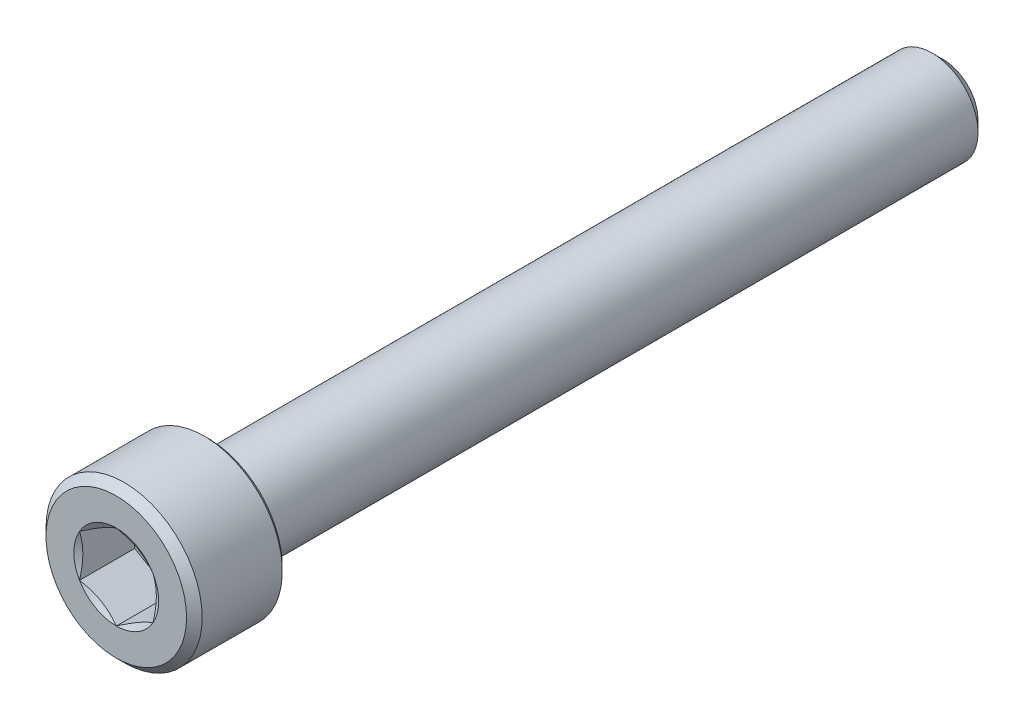
ISO-10303-21;
HEADER;
FILE_DESCRIPTION(('STEP AP214'),'2;1');
FILE_NAME('part.step','',(''),(''),'','','');
FILE_SCHEMA(('AUTOMOTIVE_DESIGN { 1 0 10303 214 1 1 1 1 }'));
ENDSEC;
DATA;
#1=APPLICATION_CONTEXT('core data for automotive mechanical design processes');
#2=APPLICATION_PROTOCOL_DEFINITION('international standard','automotive_design',2000,#1);
#3=PRODUCT_CONTEXT('',#1,'mechanical');
#4=PRODUCT('Part','Part','',(#3));
#5=PRODUCT_RELATED_PRODUCT_CATEGORY('part','',(#4));
#6=PRODUCT_DEFINITION_FORMATION('','',#4);
#7=PRODUCT_DEFINITION_CONTEXT('part definition',#1,'design');
#8=PRODUCT_DEFINITION('design','',#6,#7);
#9=PRODUCT_DEFINITION_SHAPE('','',#8);
#10=(LENGTH_UNIT() NAMED_UNIT(*) SI_UNIT(.MILLI.,.METRE.));
#11=(NAMED_UNIT(*) PLANE_ANGLE_UNIT() SI_UNIT($,.RADIAN.));
#12=(NAMED_UNIT(*) SI_UNIT($,.STERADIAN.) SOLID_ANGLE_UNIT());
#13=UNCERTAINTY_MEASURE_WITH_UNIT(LENGTH_MEASURE(1.E-05),#10,'distance_accuracy_value','');
#14=(GEOMETRIC_REPRESENTATION_CONTEXT(3) GLOBAL_UNCERTAINTY_ASSIGNED_CONTEXT((#13)) GLOBAL_UNIT_ASSIGNED_CONTEXT((#10,
#11,#12)) REPRESENTATION_CONTEXT('',''));
#15=CARTESIAN_POINT('',(0.,0.,0.));
#16=DIRECTION('',(0.,0.,1.));
#17=DIRECTION('',(1.,0.,0.));
#18=AXIS2_PLACEMENT_3D('',#15,#16,#17);
#19=CARTESIAN_POINT('',(-4.03749999999997,0.,17.5));
#20=DIRECTION('',(0.,0.,-1.));
#21=DIRECTION('',(-1.,0.,0.));
#22=AXIS2_PLACEMENT_3D('',#19,#20,#21);
#23=PLANE('',#22);
#24=CARTESIAN_POINT('',(0.,0.,17.5));
#25=DIRECTION('',(0.,0.,-1.));
#26=DIRECTION('',(-1.,0.,0.));
#27=AXIS2_PLACEMENT_3D('',#24,#25,#26);
#28=CIRCLE('',#27,2.5);
#29=CARTESIAN_POINT('',(-2.5,0.,17.5));
#30=VERTEX_POINT('',#29);
#31=EDGE_CURVE('E12',#30,#30,#28,.T.);
#32=ORIENTED_EDGE('',*,*,#31,.F.);
#33=EDGE_LOOP('',(#32));
#34=FACE_BOUND('',#33,.T.);
#35=CARTESIAN_POINT('',(0.,0.,17.5));
#36=DIRECTION('',(0.,0.,-1.));
#37=DIRECTION('',(-1.,0.,0.));
#38=AXIS2_PLACEMENT_3D('',#35,#36,#37);
#39=CIRCLE('',#38,4.03749999999997);
#40=CARTESIAN_POINT('',(-4.03749999999997,0.,17.5));
#41=VERTEX_POINT('',#40);
#42=EDGE_CURVE('E260',#41,#41,#39,.T.);
#43=ORIENTED_EDGE('',*,*,#42,.T.);
#44=EDGE_LOOP('',(#43));
#45=FACE_BOUND('',#44,.T.);
#46=ADVANCED_FACE('F42',(#34,#45),#23,.T.);
#47=CARTESIAN_POINT('',(0.,0.,19.5));
#48=DIRECTION('',(0.,0.,1.));
#49=DIRECTION('',(1.,0.,0.));
#50=AXIS2_PLACEMENT_3D('',#47,#48,#49);
#51=PLANE('',#50);
#52=DIRECTION('',(-0.866025403784439,0.5,0.));
#53=VECTOR('',#52,1.);
#54=CARTESIAN_POINT('',(2.,1.15470053837925,19.5));
#55=LINE('',#54,#53);
#56=CARTESIAN_POINT('',(2.,1.15470053837925,19.5));
#57=VERTEX_POINT('',#56);
#58=CARTESIAN_POINT('',(0.,2.3094010767585,19.5));
#59=VERTEX_POINT('',#58);
#60=EDGE_CURVE('E108',#57,#59,#55,.T.);
#61=ORIENTED_EDGE('',*,*,#60,.T.);
#62=DIRECTION('',(-0.866025403784438,-0.5,0.));
#63=VECTOR('',#62,1.);
#64=CARTESIAN_POINT('',(0.,2.3094010767585,19.5));
#65=LINE('',#64,#63);
#66=CARTESIAN_POINT('',(-2.,1.15470053837925,19.5));
#67=VERTEX_POINT('',#66);
#68=EDGE_CURVE('E227',#59,#67,#65,.T.);
#69=ORIENTED_EDGE('',*,*,#68,.T.);
#70=DIRECTION('',(0.,-1.,0.));
#71=VECTOR('',#70,1.);
#72=CARTESIAN_POINT('',(-2.,1.15470053837925,19.5));
#73=LINE('',#72,#71);
#74=CARTESIAN_POINT('',(-2.,-1.15470053837925,19.5));
#75=VERTEX_POINT('',#74);
#76=EDGE_CURVE('E230',#67,#75,#73,.T.);
#77=ORIENTED_EDGE('',*,*,#76,.T.);
#78=DIRECTION('',(0.866025403784439,-0.5,0.));
#79=VECTOR('',#78,1.);
#80=CARTESIAN_POINT('',(-2.,-1.15470053837925,19.5));
#81=LINE('',#80,#79);
#82=CARTESIAN_POINT('',(0.,-2.3094010767585,19.5));
#83=VERTEX_POINT('',#82);
#84=EDGE_CURVE('E231',#75,#83,#81,.T.);
#85=ORIENTED_EDGE('',*,*,#84,.T.);
#86=DIRECTION('',(0.866025403784439,0.5,0.));
#87=VECTOR('',#86,1.);
#88=CARTESIAN_POINT('',(0.,-2.3094010767585,19.5));
#89=LINE('',#88,#87);
#90=CARTESIAN_POINT('',(2.,-1.15470053837925,19.5));
#91=VERTEX_POINT('',#90);
#92=EDGE_CURVE('E236',#83,#91,#89,.T.);
#93=ORIENTED_EDGE('',*,*,#92,.T.);
#94=DIRECTION('',(0.,1.,0.));
#95=VECTOR('',#94,1.);
#96=CARTESIAN_POINT('',(2.,-1.15470053837925,19.5));
#97=LINE('',#96,#95);
#98=EDGE_CURVE('E229',#91,#57,#97,.T.);
#99=ORIENTED_EDGE('',*,*,#98,.T.);
#100=EDGE_LOOP('',(#61,#69,#77,#85,#93,#99));
#101=FACE_BOUND('',#100,.T.);
#102=ADVANCED_FACE('F216',(#101),#51,.T.);
#103=CARTESIAN_POINT('',(0.,2.3094010767585,19.5));
#104=DIRECTION('',(-0.5,0.866025403784439,0.));
#105=DIRECTION('',(-0.866025403784439,-0.5,0.));
#106=AXIS2_PLACEMENT_3D('',#103,#104,#105);
#107=PLANE('',#106);
#108=DIRECTION('',(0.,0.,1.));
#109=VECTOR('',#108,1.);
#110=CARTESIAN_POINT('',(0.,2.3094010767585,19.5));
#111=LINE('',#110,#109);
#112=CARTESIAN_POINT('',(0.,2.3094010767585,22.5));
#113=VERTEX_POINT('',#112);
#114=EDGE_CURVE('E64',#59,#113,#111,.T.);
#115=ORIENTED_EDGE('',*,*,#114,.T.);
#116=CARTESIAN_POINT('',(0.000199999999999582,2.30951654681234,22.5000666716664));
#117=CARTESIAN_POINT('',(-0.0876912629000605,2.25877250251757,22.4707567411466));
#118=CARTESIAN_POINT('',(-0.176341194473592,2.20759044065995,22.4441000570264));
#119=CARTESIAN_POINT('',(-0.355176246997803,2.10433997494456,22.3975696960667));
#120=CARTESIAN_POINT('',(-0.445364546505037,2.0522697359463,22.3777124814287));
#121=CARTESIAN_POINT('',(-0.624623385763307,1.94877459684592,22.3468006690692));
#122=CARTESIAN_POINT('',(-0.713666338226305,1.89736562427197,22.3355403566445));
#123=CARTESIAN_POINT('',(-0.892171397785044,1.79430568008402,22.3220958676406));
#124=CARTESIAN_POINT('',(-0.981632855703959,1.74265508327244,22.3199005599994));
#125=CARTESIAN_POINT('',(-1.1488083535488,1.64613626458981,22.3244581943766));
#126=CARTESIAN_POINT('',(-1.22654737026578,1.60125362236172,22.3300920797329));
#127=CARTESIAN_POINT('',(-1.38151891453613,1.51178075956051,22.3479511003068));
#128=CARTESIAN_POINT('',(-1.4587509057412,1.46719084864821,22.3601823410694));
#129=CARTESIAN_POINT('',(-1.6140421864822,1.37753338590959,22.3907606419135));
#130=CARTESIAN_POINT('',(-1.69208181310738,1.33247718647009,22.4092373721116));
#131=CARTESIAN_POINT('',(-1.84699686569213,1.24303693915875,22.4511727232588));
#132=CARTESIAN_POINT('',(-1.92387427762312,1.1986517446858,22.4746214855382));
#133=CARTESIAN_POINT('',(-2.0002,1.15458506832541,22.5000666716664));
#134=B_SPLINE_CURVE_WITH_KNOTS('',3,(#116,#117,#118,#119,#120,#121,#122,#123,#124,#125,#126,
#127,#128,#129,#130,#131,#132,#133),.UNSPECIFIED.,.F.,.F.,(4,2,2,2,2,2,2,2,4),(0.,
0.317031824695609,0.634825876346563,0.944753967652636,1.25430138000371,1.52387047293094,
1.79368946861028,2.06949491027634,2.34475850821472),.UNSPECIFIED.);
#135=CARTESIAN_POINT('',(-2.,1.15470053837925,22.5));
#136=VERTEX_POINT('',#135);
#137=EDGE_CURVE('E121',#113,#136,#134,.T.);
#138=ORIENTED_EDGE('',*,*,#137,.T.);
#139=DIRECTION('',(0.,0.,1.));
#140=VECTOR('',#139,1.);
#141=CARTESIAN_POINT('',(-2.,1.15470053837925,19.5));
#142=LINE('',#141,#140);
#143=EDGE_CURVE('E245',#67,#136,#142,.T.);
#144=ORIENTED_EDGE('',*,*,#143,.F.);
#145=ORIENTED_EDGE('',*,*,#68,.F.);
#146=EDGE_LOOP('',(#115,#138,#144,#145));
#147=FACE_BOUND('',#146,.T.);
#148=ADVANCED_FACE('F155',(#147),#107,.F.);
#149=CARTESIAN_POINT('',(-2.,1.15470053837925,19.5));
#150=DIRECTION('',(-1.,0.,0.));
#151=DIRECTION('',(0.,-1.,0.));
#152=AXIS2_PLACEMENT_3D('',#149,#150,#151);
#153=PLANE('',#152);
#154=ORIENTED_EDGE('',*,*,#143,.T.);
#155=CARTESIAN_POINT('',(-2.,-2.99029024286746,23.2436705774789));
#156=CARTESIAN_POINT('',(-2.,-2.9039233549122,23.2022350128154));
#157=CARTESIAN_POINT('',(-2.,-2.81734606544375,23.1612298310159));
#158=CARTESIAN_POINT('',(-2.,-2.64365854493735,23.0803243821909));
#159=CARTESIAN_POINT('',(-2.,-2.55654822138744,23.0404243140125));
#160=CARTESIAN_POINT('',(-2.,-2.38118302896117,22.9617503389695));
#161=CARTESIAN_POINT('',(-2.,-2.29292442261223,22.9229847316336));
#162=CARTESIAN_POINT('',(-2.,-2.11566660170982,22.8471918635543));
#163=CARTESIAN_POINT('',(-2.,-2.02666742594867,22.8101645124244));
#164=CARTESIAN_POINT('',(-2.,-1.84544249851511,22.7373681681925));
#165=CARTESIAN_POINT('',(-2.,-1.75319322532995,22.701657387434));
#166=CARTESIAN_POINT('',(-2.,-1.56757885700113,22.6332048464352));
#167=CARTESIAN_POINT('',(-2.,-1.4742136338563,22.6004634305571));
#168=CARTESIAN_POINT('',(-2.,-1.28643446361951,22.5388859327172));
#169=CARTESIAN_POINT('',(-2.,-1.19202351048257,22.5100408191443));
#170=CARTESIAN_POINT('',(-2.,-1.00184859453872,22.4572423245238));
#171=CARTESIAN_POINT('',(-2.,-0.906084974095544,22.4332877285792));
#172=CARTESIAN_POINT('',(-2.,-0.713403981060254,22.3915474538638));
#173=CARTESIAN_POINT('',(-2.,-0.616489407871837,22.3737491049484));
#174=CARTESIAN_POINT('',(-2.,-0.421576659767191,22.3454859555612));
#175=CARTESIAN_POINT('',(-2.,-0.323578558532563,22.3350206595082));
#176=CARTESIAN_POINT('',(-2.,-0.128212412243735,22.3223976828881));
#177=CARTESIAN_POINT('',(-2.,-0.0308508865278537,22.3201419664817));
#178=CARTESIAN_POINT('',(-2.,0.163710907351544,22.3238660001585));
#179=CARTESIAN_POINT('',(-2.,0.26091116515686,22.3298462601828));
#180=CARTESIAN_POINT('',(-2.,0.500738496706,22.3542367986828));
#181=CARTESIAN_POINT('',(-2.,0.642900874941927,22.3772179857328));
#182=CARTESIAN_POINT('',(-2.,0.924461055762405,22.4364797724985));
#183=CARTESIAN_POINT('',(-2.,1.06385531203148,22.4727764011974));
#184=CARTESIAN_POINT('',(-2.,1.27233476439731,22.5347799260889));
#185=CARTESIAN_POINT('',(-2.,1.34249760828297,22.5569967132613));
#186=CARTESIAN_POINT('',(-2.,1.48209294499886,22.6034854664852));
#187=CARTESIAN_POINT('',(-2.,1.5515258636265,22.6277561499463));
#188=CARTESIAN_POINT('',(-2.,1.68975413890005,22.6780002153862));
#189=CARTESIAN_POINT('',(-2.,1.75854960883308,22.7039732879257));
#190=CARTESIAN_POINT('',(-2.,1.89559846372949,22.7573411907401));
#191=CARTESIAN_POINT('',(-2.,1.96385175484502,22.7847362612267));
#192=CARTESIAN_POINT('',(-2.,2.1380709928287,22.8564181386155));
#193=CARTESIAN_POINT('',(-2.,2.24368858156614,22.901550707622));
#194=CARTESIAN_POINT('',(-2.,2.45396999511266,22.9939914959886));
#195=CARTESIAN_POINT('',(-2.,2.55863374776564,23.0412998783351));
#196=CARTESIAN_POINT('',(-2.,2.87151206778261,23.1857217451608));
#197=CARTESIAN_POINT('',(-2.,3.0785787487255,23.2853171433883));
#198=CARTESIAN_POINT('',(-2.,3.49094307145926,23.4886849551519));
#199=CARTESIAN_POINT('',(-2.,3.69623822556834,23.5924623531372));
#200=CARTESIAN_POINT('',(-2.,4.10542196763743,23.8026856010433));
#201=CARTESIAN_POINT('',(-2.,4.30931073022524,23.9091311117793));
#202=CARTESIAN_POINT('',(-2.,4.69691639401988,24.113726514207));
#203=CARTESIAN_POINT('',(-2.,4.88072085209384,24.2117111050986));
#204=CARTESIAN_POINT('',(-2.,5.2477385233816,24.4087967213488));
#205=CARTESIAN_POINT('',(-2.,5.43095171439014,24.5078977880236));
#206=CARTESIAN_POINT('',(-2.,5.79645714315414,24.7066832443465));
#207=CARTESIAN_POINT('',(-2.,5.97875053807595,24.8063655091631));
#208=CARTESIAN_POINT('',(-2.,6.34296877430456,25.0063788260171));
#209=CARTESIAN_POINT('',(-2.,6.52489363439936,25.1067098438291));
#210=CARTESIAN_POINT('',(-2.,6.70668608827319,25.2072787608358));
#211=B_SPLINE_CURVE_WITH_KNOTS('',3,(#155,#156,#157,#158,#159,#160,#161,#162,#163,#164,#165,
#166,#167,#168,#169,#170,#171,#172,#173,#174,#175,#176,#177,#178,#179,#180,#181,#182,#183,#184,
#185,#186,#187,#188,#189,#190,#191,#192,#193,#194,#195,#196,#197,#198,#199,#200,#201,#202,#203,
#204,#205,#206,#207,#208,#209,#210),.UNSPECIFIED.,.F.,.F.,(4,2,2,2,2,2,2,2,2,2,2,2,2,2,2,2,2,2,
2,2,2,2,2,2,2,2,2,4),(0.,0.287380681388115,0.574812740623684,0.863988372930492,1.15314895189072,
1.4498698259759,1.74662506739396,2.04268017375204,2.33866164470185,2.63403028141922,
2.92937895465126,3.22118888927989,3.51301689251078,3.94415417741651,4.37581217290736,
4.59657665342085,4.81720427698904,5.03779190819845,5.25841692430919,5.60295100374334,
5.94751093378603,6.63674459882491,7.32682556520813,8.01681924533215,8.6416872890753,
9.26657853306545,9.88988035134099,10.5131495508289),.UNSPECIFIED.);
#212=CARTESIAN_POINT('',(-2.,-1.15470053837926,22.5));
#213=VERTEX_POINT('',#212);
#214=EDGE_CURVE('E128',#136,#213,#211,.F.);
#215=ORIENTED_EDGE('',*,*,#214,.T.);
#216=DIRECTION('',(0.,0.,1.));
#217=VECTOR('',#216,1.);
#218=CARTESIAN_POINT('',(-2.,-1.15470053837925,19.5));
#219=LINE('',#218,#217);
#220=EDGE_CURVE('E243',#75,#213,#219,.T.);
#221=ORIENTED_EDGE('',*,*,#220,.F.);
#222=ORIENTED_EDGE('',*,*,#76,.F.);
#223=EDGE_LOOP('',(#154,#215,#221,#222));
#224=FACE_BOUND('',#223,.T.);
#225=ADVANCED_FACE('F150',(#224),#153,.F.);
#226=CARTESIAN_POINT('',(-2.,-1.15470053837925,19.5));
#227=DIRECTION('',(-0.5,-0.866025403784439,0.));
#228=DIRECTION('',(0.866025403784439,-0.5,0.));
#229=AXIS2_PLACEMENT_3D('',#226,#227,#228);
#230=PLANE('',#229);
#231=ORIENTED_EDGE('',*,*,#220,.T.);
#232=CARTESIAN_POINT('',(-2.0002,-1.15458506832541,22.5000666716664));
#233=CARTESIAN_POINT('',(-1.91230873709994,-1.20532911262018,22.4707567411466));
#234=CARTESIAN_POINT('',(-1.82365880552641,-1.2565111744778,22.4441000570264));
#235=CARTESIAN_POINT('',(-1.6448237530022,-1.35976164019319,22.3975696960666));
#236=CARTESIAN_POINT('',(-1.55463545349496,-1.41183187919145,22.3777124814287));
#237=CARTESIAN_POINT('',(-1.37537661423669,-1.51532701829183,22.3468006690692));
#238=CARTESIAN_POINT('',(-1.2863336617737,-1.56673599086578,22.3355403566445));
#239=CARTESIAN_POINT('',(-1.10782860221496,-1.66979593505373,22.3220958676406));
#240=CARTESIAN_POINT('',(-1.01836714429604,-1.72144653186531,22.3199005599994));
#241=CARTESIAN_POINT('',(-0.851191646451201,-1.81796535054794,22.3244581943766));
#242=CARTESIAN_POINT('',(-0.773452629734216,-1.86284799277603,22.3300920797329));
#243=CARTESIAN_POINT('',(-0.618481085463866,-1.95232085557725,22.3479511003068));
#244=CARTESIAN_POINT('',(-0.541249094258801,-1.99691076648954,22.3601823410694));
#245=CARTESIAN_POINT('',(-0.385957813517799,-2.08656822922816,22.3907606419135));
#246=CARTESIAN_POINT('',(-0.30791818689262,-2.13162442866767,22.4092373721116));
#247=CARTESIAN_POINT('',(-0.153003134307865,-2.221064675979,22.4511727232588));
#248=CARTESIAN_POINT('',(-0.07612572237688,-2.26544987045196,22.4746214855382));
#249=CARTESIAN_POINT('',(0.000200000000000351,-2.30951654681234,22.5000666716664));
#250=B_SPLINE_CURVE_WITH_KNOTS('',3,(#232,#233,#234,#235,#236,#237,#238,#239,#240,#241,#242,
#243,#244,#245,#246,#247,#248,#249),.UNSPECIFIED.,.F.,.F.,(4,2,2,2,2,2,2,2,4),(0.,
0.31703182469561,0.634825876346564,0.944753967652636,1.25430138000371,1.52387047293094,
1.79368946861028,2.06949491027634,2.34475850821472),.UNSPECIFIED.);
#251=CARTESIAN_POINT('',(0.,-2.30940107675851,22.5));
#252=VERTEX_POINT('',#251);
#253=EDGE_CURVE('E131',#213,#252,#250,.T.);
#254=ORIENTED_EDGE('',*,*,#253,.T.);
#255=DIRECTION('',(0.,0.,1.));
#256=VECTOR('',#255,1.);
#257=CARTESIAN_POINT('',(0.,-2.3094010767585,19.5));
#258=LINE('',#257,#256);
#259=EDGE_CURVE('E240',#83,#252,#258,.T.);
#260=ORIENTED_EDGE('',*,*,#259,.F.);
#261=ORIENTED_EDGE('',*,*,#84,.F.);
#262=EDGE_LOOP('',(#231,#254,#260,#261));
#263=FACE_BOUND('',#262,.T.);
#264=ADVANCED_FACE('F154',(#263),#230,.F.);
#265=CARTESIAN_POINT('',(0.,-2.3094010767585,19.5));
#266=DIRECTION('',(0.5,-0.866025403784438,0.));
#267=DIRECTION('',(0.866025403784439,0.5,0.));
#268=AXIS2_PLACEMENT_3D('',#265,#266,#267);
#269=PLANE('',#268);
#270=ORIENTED_EDGE('',*,*,#259,.T.);
#271=CARTESIAN_POINT('',(-0.000199999999999377,-2.30951654681234,22.5000666716664));
#272=CARTESIAN_POINT('',(0.0876912629000602,-2.25877250251758,22.4707567411466));
#273=CARTESIAN_POINT('',(0.176341194473591,-2.20759044065996,22.4441000570264));
#274=CARTESIAN_POINT('',(0.355176246997802,-2.10433997494456,22.3975696960666));
#275=CARTESIAN_POINT('',(0.445364546505036,-2.05226973594631,22.3777124814287));
#276=CARTESIAN_POINT('',(0.624623385763306,-1.94877459684592,22.3468006690692));
#277=CARTESIAN_POINT('',(0.713666338226304,-1.89736562427197,22.3355403566445));
#278=CARTESIAN_POINT('',(0.892171397785043,-1.79430568008402,22.3220958676406));
#279=CARTESIAN_POINT('',(0.981632855703958,-1.74265508327244,22.3199005599994));
#280=CARTESIAN_POINT('',(1.1488083535488,-1.64613626458981,22.3244581943766));
#281=CARTESIAN_POINT('',(1.22654737026578,-1.60125362236173,22.3300920797329));
#282=CARTESIAN_POINT('',(1.38151891453613,-1.51178075956051,22.3479511003068));
#283=CARTESIAN_POINT('',(1.4587509057412,-1.46719084864821,22.3601823410694));
#284=CARTESIAN_POINT('',(1.6140421864822,-1.37753338590959,22.3907606419135));
#285=CARTESIAN_POINT('',(1.69208181310738,-1.33247718647009,22.4092373721116));
#286=CARTESIAN_POINT('',(1.84699686569214,-1.24303693915875,22.4511727232588));
#287=CARTESIAN_POINT('',(1.92387427762312,-1.1986517446858,22.4746214855382));
#288=CARTESIAN_POINT('',(2.0002,-1.15458506832541,22.5000666716664));
#289=B_SPLINE_CURVE_WITH_KNOTS('',3,(#271,#272,#273,#274,#275,#276,#277,#278,#279,#280,#281,
#282,#283,#284,#285,#286,#287,#288),.UNSPECIFIED.,.F.,.F.,(4,2,2,2,2,2,2,2,4),(0.,
0.317031824695609,0.634825876346563,0.944753967652635,1.25430138000371,1.52387047293094,
1.79368946861028,2.06949491027634,2.34475850821472),.UNSPECIFIED.);
#290=CARTESIAN_POINT('',(2.,-1.15470053837925,22.5));
#291=VERTEX_POINT('',#290);
#292=EDGE_CURVE('E116',#252,#291,#289,.T.);
#293=ORIENTED_EDGE('',*,*,#292,.T.);
#294=DIRECTION('',(0.,0.,1.));
#295=VECTOR('',#294,1.);
#296=CARTESIAN_POINT('',(2.,-1.15470053837925,19.5));
#297=LINE('',#296,#295);
#298=EDGE_CURVE('E114',#91,#291,#297,.T.);
#299=ORIENTED_EDGE('',*,*,#298,.F.);
#300=ORIENTED_EDGE('',*,*,#92,.F.);
#301=EDGE_LOOP('',(#270,#293,#299,#300));
#302=FACE_BOUND('',#301,.T.);
#303=ADVANCED_FACE('F161',(#302),#269,.F.);
#304=CARTESIAN_POINT('',(2.,-1.15470053837925,19.5));
#305=DIRECTION('',(1.,0.,0.));
#306=DIRECTION('',(0.,0.,-1.));
#307=AXIS2_PLACEMENT_3D('',#304,#305,#306);
#308=PLANE('',#307);
#309=ORIENTED_EDGE('',*,*,#298,.T.);
#310=CARTESIAN_POINT('',(2.,-2.99029024286747,23.2436705774789));
#311=CARTESIAN_POINT('',(2.,-2.9039233549122,23.2022350128154));
#312=CARTESIAN_POINT('',(2.,-2.81734606544376,23.1612298310159));
#313=CARTESIAN_POINT('',(2.,-2.64365854493735,23.0803243821909));
#314=CARTESIAN_POINT('',(2.,-2.55654822138744,23.0404243140125));
#315=CARTESIAN_POINT('',(2.,-2.38118302896117,22.9617503389695));
#316=CARTESIAN_POINT('',(2.,-2.29292442261223,22.9229847316336));
#317=CARTESIAN_POINT('',(2.,-2.11566660170982,22.8471918635543));
#318=CARTESIAN_POINT('',(2.,-2.02666742594867,22.8101645124244));
#319=CARTESIAN_POINT('',(2.,-1.84544249851511,22.7373681681925));
#320=CARTESIAN_POINT('',(2.,-1.75319322532995,22.701657387434));
#321=CARTESIAN_POINT('',(2.,-1.56757885700113,22.6332048464352));
#322=CARTESIAN_POINT('',(2.,-1.4742136338563,22.6004634305571));
#323=CARTESIAN_POINT('',(2.,-1.28643446361951,22.5388859327172));
#324=CARTESIAN_POINT('',(2.,-1.19202351048257,22.5100408191443));
#325=CARTESIAN_POINT('',(2.,-1.00184859453872,22.4572423245238));
#326=CARTESIAN_POINT('',(2.,-0.906084974095544,22.4332877285792));
#327=CARTESIAN_POINT('',(2.,-0.713403981060254,22.3915474538638));
#328=CARTESIAN_POINT('',(2.,-0.616489407871837,22.3737491049484));
#329=CARTESIAN_POINT('',(2.,-0.421576659767191,22.3454859555612));
#330=CARTESIAN_POINT('',(2.,-0.323578558532563,22.3350206595082));
#331=CARTESIAN_POINT('',(2.,-0.128212412243735,22.3223976828881));
#332=CARTESIAN_POINT('',(2.,-0.0308508865278543,22.3201419664817));
#333=CARTESIAN_POINT('',(2.,0.163710907351543,22.3238660001585));
#334=CARTESIAN_POINT('',(2.,0.260911165156859,22.3298462601828));
#335=CARTESIAN_POINT('',(2.,0.500738496705998,22.3542367986828));
#336=CARTESIAN_POINT('',(2.,0.642900874941925,22.3772179857328));
#337=CARTESIAN_POINT('',(2.,0.924461055762403,22.4364797724985));
#338=CARTESIAN_POINT('',(2.,1.06385531203148,22.4727764011974));
#339=CARTESIAN_POINT('',(2.,1.27233476439731,22.5347799260889));
#340=CARTESIAN_POINT('',(2.,1.34249760828297,22.5569967132613));
#341=CARTESIAN_POINT('',(2.,1.48209294499886,22.6034854664852));
#342=CARTESIAN_POINT('',(2.,1.5515258636265,22.6277561499463));
#343=CARTESIAN_POINT('',(2.,1.68975413890004,22.6780002153862));
#344=CARTESIAN_POINT('',(2.,1.75854960883307,22.7039732879257));
#345=CARTESIAN_POINT('',(2.,1.89559846372949,22.7573411907401));
#346=CARTESIAN_POINT('',(2.,1.96385175484502,22.7847362612267));
#347=CARTESIAN_POINT('',(2.,2.1380709928287,22.8564181386155));
#348=CARTESIAN_POINT('',(2.,2.24368858156614,22.901550707622));
#349=CARTESIAN_POINT('',(2.,2.45396999511265,22.9939914959886));
#350=CARTESIAN_POINT('',(2.,2.55863374776564,23.0412998783351));
#351=CARTESIAN_POINT('',(2.,2.87151206778261,23.1857217451608));
#352=CARTESIAN_POINT('',(2.,3.0785787487255,23.2853171433883));
#353=CARTESIAN_POINT('',(2.,3.49094307145926,23.4886849551519));
#354=CARTESIAN_POINT('',(2.,3.69623822556834,23.5924623531372));
#355=CARTESIAN_POINT('',(2.,4.10542196763743,23.8026856010433));
#356=CARTESIAN_POINT('',(2.,4.30931073022524,23.9091311117793));
#357=CARTESIAN_POINT('',(2.,4.69691639401988,24.113726514207));
#358=CARTESIAN_POINT('',(2.,4.88072085209384,24.2117111050986));
#359=CARTESIAN_POINT('',(2.,5.2477385233816,24.4087967213488));
#360=CARTESIAN_POINT('',(2.,5.43095171439014,24.5078977880236));
#361=CARTESIAN_POINT('',(2.,5.79645714315414,24.7066832443465));
#362=CARTESIAN_POINT('',(2.,5.97875053807595,24.8063655091631));
#363=CARTESIAN_POINT('',(2.,6.34296877430456,25.0063788260171));
#364=CARTESIAN_POINT('',(2.,6.52489363439936,25.1067098438291));
#365=CARTESIAN_POINT('',(2.,6.70668608827319,25.2072787608358));
#366=B_SPLINE_CURVE_WITH_KNOTS('',3,(#310,#311,#312,#313,#314,#315,#316,#317,#318,#319,#320,
#321,#322,#323,#324,#325,#326,#327,#328,#329,#330,#331,#332,#333,#334,#335,#336,#337,#338,#339,
#340,#341,#342,#343,#344,#345,#346,#347,#348,#349,#350,#351,#352,#353,#354,#355,#356,#357,#358,
#359,#360,#361,#362,#363,#364,#365),.UNSPECIFIED.,.F.,.F.,(4,2,2,2,2,2,2,2,2,2,2,2,2,2,2,2,2,2,
2,2,2,2,2,2,2,2,2,4),(0.,0.287380681388115,0.574812740623684,0.863988372930489,1.15314895189073,
1.4498698259759,1.74662506739396,2.04268017375205,2.33866164470185,2.63403028141922,
2.92937895465126,3.22118888927989,3.51301689251078,3.94415417741651,4.37581217290736,
4.59657665342085,4.81720427698904,5.03779190819845,5.25841692430919,5.60295100374334,
5.94751093378603,6.63674459882492,7.32682556520813,8.01681924533216,8.6416872890753,
9.26657853306545,9.88988035134099,10.5131495508289),.UNSPECIFIED.);
#367=CARTESIAN_POINT('',(2.,1.15470053837925,22.5));
#368=VERTEX_POINT('',#367);
#369=EDGE_CURVE('E100',#291,#368,#366,.T.);
#370=ORIENTED_EDGE('',*,*,#369,.T.);
#371=DIRECTION('',(0.,0.,1.));
#372=VECTOR('',#371,1.);
#373=CARTESIAN_POINT('',(2.,1.15470053837925,19.5));
#374=LINE('',#373,#372);
#375=EDGE_CURVE('E113',#57,#368,#374,.T.);
#376=ORIENTED_EDGE('',*,*,#375,.F.);
#377=ORIENTED_EDGE('',*,*,#98,.F.);
#378=EDGE_LOOP('',(#309,#370,#376,#377));
#379=FACE_BOUND('',#378,.T.);
#380=ADVANCED_FACE('F111',(#379),#308,.F.);
#381=CARTESIAN_POINT('',(2.,1.15470053837925,19.5));
#382=DIRECTION('',(0.5,0.866025403784439,0.));
#383=DIRECTION('',(-0.866025403784439,0.5,0.));
#384=AXIS2_PLACEMENT_3D('',#381,#382,#383);
#385=PLANE('',#384);
#386=ORIENTED_EDGE('',*,*,#375,.T.);
#387=CARTESIAN_POINT('',(2.0002,1.15458506832541,22.5000666716664));
#388=CARTESIAN_POINT('',(1.91230873709994,1.20532911262018,22.4707567411466));
#389=CARTESIAN_POINT('',(1.82365880552641,1.2565111744778,22.4441000570264));
#390=CARTESIAN_POINT('',(1.6448237530022,1.35976164019319,22.3975696960667));
#391=CARTESIAN_POINT('',(1.55463545349496,1.41183187919145,22.3777124814287));
#392=CARTESIAN_POINT('',(1.37537661423669,1.51532701829183,22.3468006690692));
#393=CARTESIAN_POINT('',(1.2863336617737,1.56673599086578,22.3355403566445));
#394=CARTESIAN_POINT('',(1.10782860221496,1.66979593505373,22.3220958676406));
#395=CARTESIAN_POINT('',(1.01836714429604,1.72144653186531,22.3199005599994));
#396=CARTESIAN_POINT('',(0.851191646451201,1.81796535054794,22.3244581943766));
#397=CARTESIAN_POINT('',(0.773452629734216,1.86284799277603,22.3300920797329));
#398=CARTESIAN_POINT('',(0.618481085463866,1.95232085557725,22.3479511003068));
#399=CARTESIAN_POINT('',(0.541249094258801,1.99691076648954,22.3601823410694));
#400=CARTESIAN_POINT('',(0.385957813517799,2.08656822922816,22.3907606419135));
#401=CARTESIAN_POINT('',(0.30791818689262,2.13162442866767,22.4092373721116));
#402=CARTESIAN_POINT('',(0.153003134307865,2.221064675979,22.4511727232588));
#403=CARTESIAN_POINT('',(0.0761257223768795,2.26544987045196,22.4746214855382));
#404=CARTESIAN_POINT('',(-0.000200000000000295,2.30951654681234,22.5000666716664));
#405=B_SPLINE_CURVE_WITH_KNOTS('',3,(#387,#388,#389,#390,#391,#392,#393,#394,#395,#396,#397,
#398,#399,#400,#401,#402,#403,#404),.UNSPECIFIED.,.F.,.F.,(4,2,2,2,2,2,2,2,4),(0.,
0.317031824695609,0.634825876346563,0.944753967652636,1.25430138000371,1.52387047293094,
1.79368946861028,2.06949491027634,2.34475850821472),.UNSPECIFIED.);
#406=EDGE_CURVE('E105',#368,#113,#405,.T.);
#407=ORIENTED_EDGE('',*,*,#406,.T.);
#408=ORIENTED_EDGE('',*,*,#114,.F.);
#409=ORIENTED_EDGE('',*,*,#60,.F.);
#410=EDGE_LOOP('',(#386,#407,#408,#409));
#411=FACE_BOUND('',#410,.T.);
#412=ADVANCED_FACE('F118',(#411),#385,.F.);
#413=CARTESIAN_POINT('',(0.,0.,22.5));
#414=DIRECTION('',(0.,0.,1.));
#415=DIRECTION('',(1.,0.,0.));
#416=AXIS2_PLACEMENT_3D('',#413,#414,#415);
#417=CONICAL_SURFACE('',#416,2.3094010767585,1.0471975511966);
#418=CARTESIAN_POINT('',(0.,0.,22.5));
#419=DIRECTION('',(0.,0.,1.));
#420=DIRECTION('',(1.,0.,0.));
#421=AXIS2_PLACEMENT_3D('',#418,#419,#420);
#422=CIRCLE('',#421,2.3094010767585);
#423=EDGE_CURVE('E127',#113,#136,#422,.T.);
#424=ORIENTED_EDGE('',*,*,#423,.T.);
#425=ORIENTED_EDGE('',*,*,#137,.F.);
#426=EDGE_LOOP('',(#424,#425));
#427=FACE_BOUND('',#426,.T.);
#428=ADVANCED_FACE('F185',(#427),#417,.F.);
#429=EDGE_CURVE('E129',#136,#213,#422,.T.);
#430=ORIENTED_EDGE('',*,*,#429,.T.);
#431=ORIENTED_EDGE('',*,*,#214,.F.);
#432=EDGE_LOOP('',(#430,#431));
#433=FACE_BOUND('',#432,.T.);
#434=ADVANCED_FACE('F296',(#433),#417,.F.);
#435=EDGE_CURVE('E285',#213,#252,#422,.T.);
#436=ORIENTED_EDGE('',*,*,#435,.T.);
#437=ORIENTED_EDGE('',*,*,#253,.F.);
#438=EDGE_LOOP('',(#436,#437));
#439=FACE_BOUND('',#438,.T.);
#440=ADVANCED_FACE('F294',(#439),#417,.F.);
#441=EDGE_CURVE('E104',#252,#291,#422,.T.);
#442=ORIENTED_EDGE('',*,*,#441,.T.);
#443=ORIENTED_EDGE('',*,*,#292,.F.);
#444=EDGE_LOOP('',(#442,#443));
#445=FACE_BOUND('',#444,.T.);
#446=ADVANCED_FACE('F291',(#445),#417,.F.);
#447=EDGE_CURVE('E50',#291,#368,#422,.T.);
#448=ORIENTED_EDGE('',*,*,#447,.T.);
#449=ORIENTED_EDGE('',*,*,#369,.F.);
#450=EDGE_LOOP('',(#448,#449));
#451=FACE_BOUND('',#450,.T.);
#452=ADVANCED_FACE('F98',(#451),#417,.F.);
#453=EDGE_CURVE('E45',#368,#113,#422,.T.);
#454=ORIENTED_EDGE('',*,*,#453,.T.);
#455=ORIENTED_EDGE('',*,*,#406,.F.);
#456=EDGE_LOOP('',(#454,#455));
#457=FACE_BOUND('',#456,.T.);
#458=ADVANCED_FACE('F106',(#457),#417,.F.);
#459=CARTESIAN_POINT('',(0.,4.24999999999999,22.5));
#460=DIRECTION('',(0.,0.,1.));
#461=DIRECTION('',(1.,0.,0.));
#462=AXIS2_PLACEMENT_3D('',#459,#460,#461);
#463=PLANE('',#462);
#464=CARTESIAN_POINT('',(0.,0.,22.5));
#465=DIRECTION('',(0.,0.,1.));
#466=DIRECTION('',(1.,0.,0.));
#467=AXIS2_PLACEMENT_3D('',#464,#465,#466);
#468=CIRCLE('',#467,3.82500000000001);
#469=CARTESIAN_POINT('',(3.82500000000001,0.,22.5));
#470=VERTEX_POINT('',#469);
#471=EDGE_CURVE('E257',#470,#470,#468,.T.);
#472=ORIENTED_EDGE('',*,*,#471,.T.);
#473=EDGE_LOOP('',(#472));
#474=FACE_BOUND('',#473,.T.);
#475=ORIENTED_EDGE('',*,*,#453,.F.);
#476=ORIENTED_EDGE('',*,*,#447,.F.);
#477=ORIENTED_EDGE('',*,*,#441,.F.);
#478=ORIENTED_EDGE('',*,*,#435,.F.);
#479=ORIENTED_EDGE('',*,*,#429,.F.);
#480=ORIENTED_EDGE('',*,*,#423,.F.);
#481=EDGE_LOOP('',(#475,#476,#477,#478,#479,#480));
#482=FACE_BOUND('',#481,.T.);
#483=ADVANCED_FACE('F124',(#474,#482),#463,.T.);
#484=CARTESIAN_POINT('',(0.,0.,22.075));
#485=DIRECTION('',(0.,0.,-1.));
#486=DIRECTION('',(-1.,0.,0.));
#487=AXIS2_PLACEMENT_3D('',#484,#485,#486);
#488=CONICAL_SURFACE('',#487,4.25,0.785398163397445);
#489=ORIENTED_EDGE('',*,*,#471,.F.);
#490=EDGE_LOOP('',(#489));
#491=FACE_BOUND('',#490,.T.);
#492=CARTESIAN_POINT('',(0.,0.,22.075));
#493=DIRECTION('',(0.,0.,1.));
#494=DIRECTION('',(1.,0.,0.));
#495=AXIS2_PLACEMENT_3D('',#492,#493,#494);
#496=CIRCLE('',#495,4.25);
#497=CARTESIAN_POINT('',(4.25,0.,22.075));
#498=VERTEX_POINT('',#497);
#499=EDGE_CURVE('E254',#498,#498,#496,.F.);
#500=ORIENTED_EDGE('',*,*,#499,.F.);
#501=EDGE_LOOP('',(#500));
#502=FACE_BOUND('',#501,.T.);
#503=ADVANCED_FACE('F190',(#491,#502),#488,.T.);
#504=CARTESIAN_POINT('',(0.,0.,-22.5));
#505=DIRECTION('',(0.,0.,-1.));
#506=DIRECTION('',(-1.,0.,0.));
#507=AXIS2_PLACEMENT_3D('',#504,#505,#506);
#508=CYLINDRICAL_SURFACE('',#507,4.25);
#509=CARTESIAN_POINT('',(0.,0.,17.7125));
#510=DIRECTION('',(0.,0.,-1.));
#511=DIRECTION('',(-1.,0.,0.));
#512=AXIS2_PLACEMENT_3D('',#509,#510,#511);
#513=CIRCLE('',#512,4.25);
#514=CARTESIAN_POINT('',(-4.25,0.,17.7125));
#515=VERTEX_POINT('',#514);
#516=EDGE_CURVE('E263',#515,#515,#513,.F.);
#517=ORIENTED_EDGE('',*,*,#516,.T.);
#518=EDGE_LOOP('',(#517));
#519=FACE_BOUND('',#518,.T.);
#520=ORIENTED_EDGE('',*,*,#499,.T.);
#521=EDGE_LOOP('',(#520));
#522=FACE_BOUND('',#521,.T.);
#523=ADVANCED_FACE('F186',(#519,#522),#508,.T.);
#524=CARTESIAN_POINT('',(0.,0.,17.5));
#525=DIRECTION('',(0.,0.,1.));
#526=DIRECTION('',(1.,0.,0.));
#527=AXIS2_PLACEMENT_3D('',#524,#525,#526);
#528=CONICAL_SURFACE('',#527,4.03749999999997,0.785398163397467);
#529=ORIENTED_EDGE('',*,*,#516,.F.);
#530=EDGE_LOOP('',(#529));
#531=FACE_BOUND('',#530,.T.);
#532=ORIENTED_EDGE('',*,*,#42,.F.);
#533=EDGE_LOOP('',(#532));
#534=FACE_BOUND('',#533,.T.);
#535=ADVANCED_FACE('F189',(#531,#534),#528,.T.);
#536=CARTESIAN_POINT('',(0.,0.,-22.5));
#537=DIRECTION('',(0.,0.,-1.));
#538=DIRECTION('',(-1.,0.,0.));
#539=AXIS2_PLACEMENT_3D('',#536,#537,#538);
#540=CYLINDRICAL_SURFACE('',#539,2.5);
#541=CARTESIAN_POINT('',(0.,0.,-21.9));
#542=DIRECTION('',(0.,0.,-1.));
#543=DIRECTION('',(-1.,0.,0.));
#544=AXIS2_PLACEMENT_3D('',#541,#542,#543);
#545=CIRCLE('',#544,2.5);
#546=CARTESIAN_POINT('',(-2.5,0.,-21.9));
#547=VERTEX_POINT('',#546);
#548=EDGE_CURVE('E269',#547,#547,#545,.T.);
#549=ORIENTED_EDGE('',*,*,#548,.F.);
#550=EDGE_LOOP('',(#549));
#551=FACE_BOUND('',#550,.T.);
#552=ORIENTED_EDGE('',*,*,#31,.T.);
#553=EDGE_LOOP('',(#552));
#554=FACE_BOUND('',#553,.T.);
#555=ADVANCED_FACE('F200',(#551,#554),#540,.T.);
#556=CARTESIAN_POINT('',(0.,0.,-21.9));
#557=DIRECTION('',(0.,0.,1.));
#558=DIRECTION('',(1.,0.,0.));
#559=AXIS2_PLACEMENT_3D('',#556,#557,#558);
#560=CONICAL_SURFACE('',#559,2.5,0.785398163397449);
#561=CARTESIAN_POINT('',(0.,0.,-22.5));
#562=DIRECTION('',(0.,0.,-1.));
#563=DIRECTION('',(-1.,0.,0.));
#564=AXIS2_PLACEMENT_3D('',#561,#562,#563);
#565=CIRCLE('',#564,1.9);
#566=CARTESIAN_POINT('',(-1.9,0.,-22.5));
#567=VERTEX_POINT('',#566);
#568=EDGE_CURVE('E265',#567,#567,#565,.T.);
#569=ORIENTED_EDGE('',*,*,#568,.F.);
#570=EDGE_LOOP('',(#569));
#571=FACE_BOUND('',#570,.T.);
#572=ORIENTED_EDGE('',*,*,#548,.T.);
#573=EDGE_LOOP('',(#572));
#574=FACE_BOUND('',#573,.T.);
#575=ADVANCED_FACE('F204',(#571,#574),#560,.T.);
#576=CARTESIAN_POINT('',(0.,2.49999999999999,-22.5));
#577=DIRECTION('',(0.,0.,-1.));
#578=DIRECTION('',(-1.,0.,0.));
#579=AXIS2_PLACEMENT_3D('',#576,#577,#578);
#580=PLANE('',#579);
#581=ORIENTED_EDGE('',*,*,#568,.T.);
#582=EDGE_LOOP('',(#581));
#583=FACE_BOUND('',#582,.T.);
#584=ADVANCED_FACE('F206',(#583),#580,.T.);
#585=CLOSED_SHELL('',(#46,#102,#148,#225,#264,#303,#380,#412,#428,#434,#440,#446,#452,#458,#483,
#503,#523,#535,#555,#575,#584));
#586=MANIFOLD_SOLID_BREP('B2',#585);
#587=ADVANCED_BREP_SHAPE_REPRESENTATION('',(#18,#586),#14);
#588=SHAPE_DEFINITION_REPRESENTATION(#9,#587);
ENDSEC;
END-ISO-10303-21;
